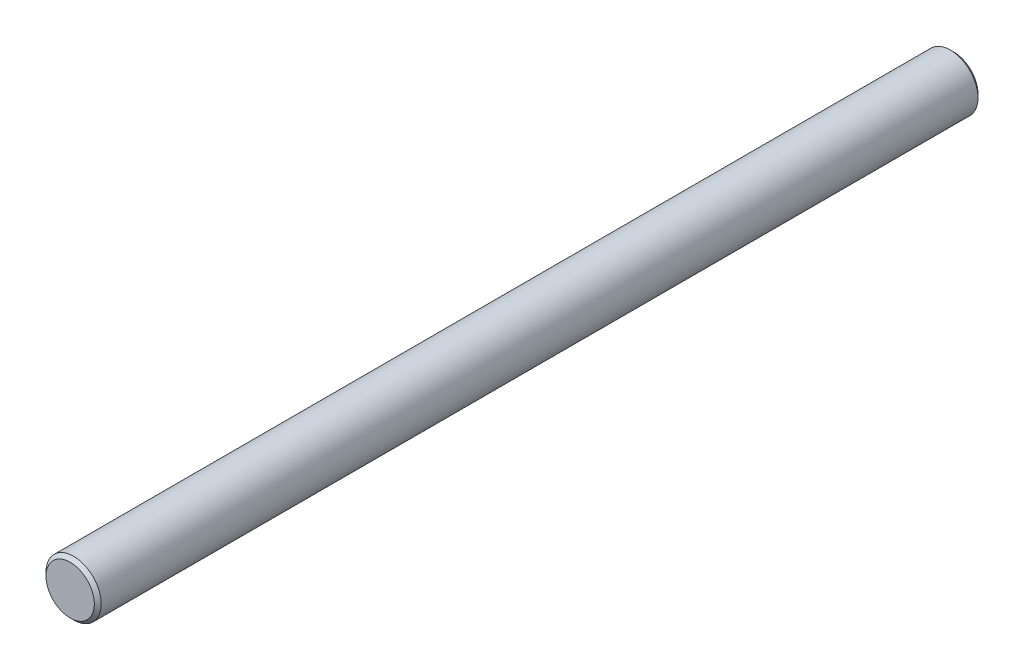
ISO-10303-21;
HEADER;
FILE_DESCRIPTION(('STEP AP214'),'2;1');
FILE_NAME('part.step','',(''),(''),'','','');
FILE_SCHEMA(('AUTOMOTIVE_DESIGN { 1 0 10303 214 1 1 1 1 }'));
ENDSEC;
DATA;
#1=APPLICATION_CONTEXT('core data for automotive mechanical design processes');
#2=APPLICATION_PROTOCOL_DEFINITION('international standard','automotive_design',2000,#1);
#3=PRODUCT_CONTEXT('',#1,'mechanical');
#4=PRODUCT('Part','Part','',(#3));
#5=PRODUCT_RELATED_PRODUCT_CATEGORY('part','',(#4));
#6=PRODUCT_DEFINITION_FORMATION('','',#4);
#7=PRODUCT_DEFINITION_CONTEXT('part definition',#1,'design');
#8=PRODUCT_DEFINITION('design','',#6,#7);
#9=PRODUCT_DEFINITION_SHAPE('','',#8);
#10=(LENGTH_UNIT() NAMED_UNIT(*) SI_UNIT(.MILLI.,.METRE.));
#11=(NAMED_UNIT(*) PLANE_ANGLE_UNIT() SI_UNIT($,.RADIAN.));
#12=(NAMED_UNIT(*) SI_UNIT($,.STERADIAN.) SOLID_ANGLE_UNIT());
#13=UNCERTAINTY_MEASURE_WITH_UNIT(LENGTH_MEASURE(1.E-05),#10,'distance_accuracy_value','');
#14=(GEOMETRIC_REPRESENTATION_CONTEXT(3) GLOBAL_UNCERTAINTY_ASSIGNED_CONTEXT((#13)) GLOBAL_UNIT_ASSIGNED_CONTEXT((#10,
#11,#12)) REPRESENTATION_CONTEXT('',''));
#15=CARTESIAN_POINT('',(0.,0.,0.));
#16=DIRECTION('',(0.,0.,1.));
#17=DIRECTION('',(1.,0.,0.));
#18=AXIS2_PLACEMENT_3D('',#15,#16,#17);
#19=CARTESIAN_POINT('',(0.,0.,128.));
#20=DIRECTION('',(0.,0.,1.));
#21=DIRECTION('',(1.,0.,0.));
#22=AXIS2_PLACEMENT_3D('',#19,#20,#21);
#23=PLANE('',#22);
#24=CARTESIAN_POINT('',(0.,0.,127.999999999929));
#25=DIRECTION('',(0.,0.,-1.));
#26=DIRECTION('',(-1.,0.,0.));
#27=AXIS2_PLACEMENT_3D('',#24,#25,#26);
#28=CIRCLE('',#27,3.50000000008777);
#29=CARTESIAN_POINT('',(-3.50000000008777,0.,127.999999999929));
#30=VERTEX_POINT('',#29);
#31=EDGE_CURVE('E18',#30,#30,#28,.T.);
#32=ORIENTED_EDGE('',*,*,#31,.F.);
#33=EDGE_LOOP('',(#32));
#34=FACE_BOUND('',#33,.T.);
#35=ADVANCED_FACE('F15',(#34),#23,.T.);
#36=CARTESIAN_POINT('',(0.,0.,0.));
#37=DIRECTION('',(0.,0.,1.));
#38=DIRECTION('',(1.,0.,0.));
#39=AXIS2_PLACEMENT_3D('',#36,#37,#38);
#40=PLANE('',#39);
#41=CARTESIAN_POINT('',(0.,0.,-5.6843418860808E-11));
#42=DIRECTION('',(0.,0.,1.));
#43=DIRECTION('',(1.,0.,0.));
#44=AXIS2_PLACEMENT_3D('',#41,#42,#43);
#45=CIRCLE('',#44,3.49999999997408);
#46=CARTESIAN_POINT('',(3.49999999997408,0.,-5.6843418860808E-11));
#47=VERTEX_POINT('',#46);
#48=EDGE_CURVE('E27',#47,#47,#45,.T.);
#49=ORIENTED_EDGE('',*,*,#48,.F.);
#50=EDGE_LOOP('',(#49));
#51=FACE_BOUND('',#50,.T.);
#52=ADVANCED_FACE('F38',(#51),#40,.F.);
#53=CARTESIAN_POINT('',(0.,0.,127.500000000111));
#54=DIRECTION('',(0.,0.,-1.));
#55=DIRECTION('',(-1.,0.,0.));
#56=AXIS2_PLACEMENT_3D('',#53,#54,#55);
#57=CONICAL_SURFACE('',#56,3.99999999984857,0.785398163340605);
#58=CARTESIAN_POINT('',(0.,0.,127.5));
#59=DIRECTION('',(0.,0.,-1.));
#60=DIRECTION('',(-1.,0.,0.));
#61=AXIS2_PLACEMENT_3D('',#58,#59,#60);
#62=CIRCLE('',#61,4.);
#63=CARTESIAN_POINT('',(-4.,0.,127.5));
#64=VERTEX_POINT('',#63);
#65=EDGE_CURVE('E22',#64,#64,#62,.T.);
#66=ORIENTED_EDGE('',*,*,#65,.F.);
#67=EDGE_LOOP('',(#66));
#68=FACE_BOUND('',#67,.T.);
#69=ORIENTED_EDGE('',*,*,#31,.T.);
#70=EDGE_LOOP('',(#69));
#71=FACE_BOUND('',#70,.T.);
#72=ADVANCED_FACE('F35',(#68,#71),#57,.T.);
#73=CARTESIAN_POINT('',(0.,0.,0.49999999987449));
#74=DIRECTION('',(0.,0.,1.));
#75=DIRECTION('',(1.,0.,0.));
#76=AXIS2_PLACEMENT_3D('',#73,#74,#75);
#77=CONICAL_SURFACE('',#76,3.99999999990541,0.785398163397448);
#78=CARTESIAN_POINT('',(0.,0.,0.499999999999973));
#79=DIRECTION('',(0.,0.,-1.));
#80=DIRECTION('',(-1.,0.,0.));
#81=AXIS2_PLACEMENT_3D('',#78,#79,#80);
#82=CIRCLE('',#81,4.);
#83=CARTESIAN_POINT('',(-4.,0.,0.499999999999973));
#84=VERTEX_POINT('',#83);
#85=EDGE_CURVE('E9',#84,#84,#82,.F.);
#86=ORIENTED_EDGE('',*,*,#85,.F.);
#87=EDGE_LOOP('',(#86));
#88=FACE_BOUND('',#87,.T.);
#89=ORIENTED_EDGE('',*,*,#48,.T.);
#90=EDGE_LOOP('',(#89));
#91=FACE_BOUND('',#90,.T.);
#92=ADVANCED_FACE('F45',(#88,#91),#77,.T.);
#93=CARTESIAN_POINT('',(0.,0.,128.));
#94=DIRECTION('',(0.,0.,-1.));
#95=DIRECTION('',(-1.,0.,0.));
#96=AXIS2_PLACEMENT_3D('',#93,#94,#95);
#97=CYLINDRICAL_SURFACE('',#96,4.);
#98=ORIENTED_EDGE('',*,*,#85,.T.);
#99=EDGE_LOOP('',(#98));
#100=FACE_BOUND('',#99,.T.);
#101=ORIENTED_EDGE('',*,*,#65,.T.);
#102=EDGE_LOOP('',(#101));
#103=FACE_BOUND('',#102,.T.);
#104=ADVANCED_FACE('F43',(#100,#103),#97,.T.);
#105=CLOSED_SHELL('',(#35,#52,#72,#92,#104));
#106=MANIFOLD_SOLID_BREP('B1',#105);
#107=ADVANCED_BREP_SHAPE_REPRESENTATION('',(#18,#106),#14);
#108=SHAPE_DEFINITION_REPRESENTATION(#9,#107);
ENDSEC;
END-ISO-10303-21;
